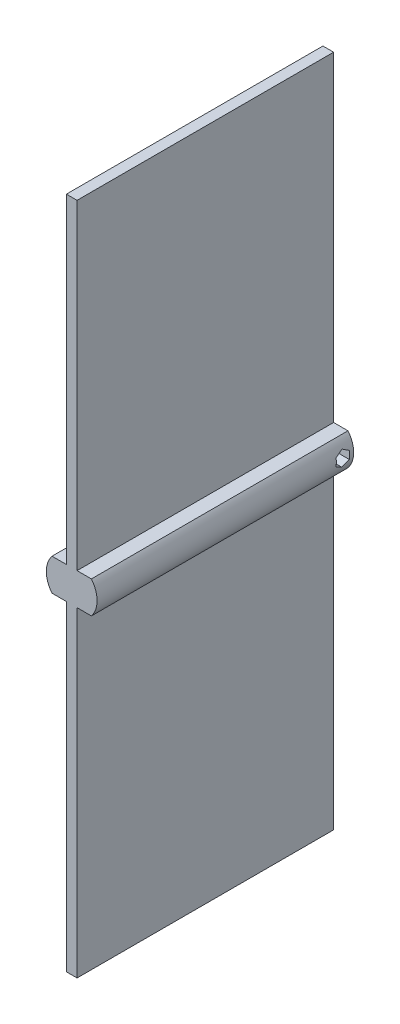
ISO-10303-21;
HEADER;
FILE_DESCRIPTION(('STEP AP214'),'2;1');
FILE_NAME('part.step','',(''),(''),'','','');
FILE_SCHEMA(('AUTOMOTIVE_DESIGN { 1 0 10303 214 1 1 1 1 }'));
ENDSEC;
DATA;
#1=APPLICATION_CONTEXT('core data for automotive mechanical design processes');
#2=APPLICATION_PROTOCOL_DEFINITION('international standard','automotive_design',2000,#1);
#3=PRODUCT_CONTEXT('',#1,'mechanical');
#4=PRODUCT('Part','Part','',(#3));
#5=PRODUCT_RELATED_PRODUCT_CATEGORY('part','',(#4));
#6=PRODUCT_DEFINITION_FORMATION('','',#4);
#7=PRODUCT_DEFINITION_CONTEXT('part definition',#1,'design');
#8=PRODUCT_DEFINITION('design','',#6,#7);
#9=PRODUCT_DEFINITION_SHAPE('','',#8);
#10=(LENGTH_UNIT() NAMED_UNIT(*) SI_UNIT(.MILLI.,.METRE.));
#11=(NAMED_UNIT(*) PLANE_ANGLE_UNIT() SI_UNIT($,.RADIAN.));
#12=(NAMED_UNIT(*) SI_UNIT($,.STERADIAN.) SOLID_ANGLE_UNIT());
#13=UNCERTAINTY_MEASURE_WITH_UNIT(LENGTH_MEASURE(1.E-05),#10,'distance_accuracy_value','');
#14=(GEOMETRIC_REPRESENTATION_CONTEXT(3) GLOBAL_UNCERTAINTY_ASSIGNED_CONTEXT((#13)) GLOBAL_UNIT_ASSIGNED_CONTEXT((#10,
#11,#12)) REPRESENTATION_CONTEXT('',''));
#15=CARTESIAN_POINT('',(0.,0.,0.));
#16=DIRECTION('',(0.,0.,1.));
#17=DIRECTION('',(1.,0.,0.));
#18=AXIS2_PLACEMENT_3D('',#15,#16,#17);
#19=CARTESIAN_POINT('',(3.68272996566406,-3.,48.001));
#20=DIRECTION('',(0.,1.,0.));
#21=DIRECTION('',(0.,0.,1.));
#22=AXIS2_PLACEMENT_3D('',#19,#20,#21);
#23=PLANE('',#22);
#24=DIRECTION('',(1.,0.,0.));
#25=VECTOR('',#24,1.);
#26=CARTESIAN_POINT('',(3.68272996566406,-3.,48.));
#27=LINE('',#26,#25);
#28=CARTESIAN_POINT('',(1.,-3.,48.));
#29=VERTEX_POINT('',#28);
#30=CARTESIAN_POINT('',(3.68272996566406,-3.,48.));
#31=VERTEX_POINT('',#30);
#32=EDGE_CURVE('E235',#29,#31,#27,.T.);
#33=ORIENTED_EDGE('',*,*,#32,.F.);
#34=DIRECTION('',(0.,0.,-1.));
#35=VECTOR('',#34,1.);
#36=CARTESIAN_POINT('',(1.,-3.,48.));
#37=LINE('',#36,#35);
#38=CARTESIAN_POINT('',(1.,-3.,0.));
#39=VERTEX_POINT('',#38);
#40=EDGE_CURVE('E182',#29,#39,#37,.T.);
#41=ORIENTED_EDGE('',*,*,#40,.T.);
#42=DIRECTION('',(1.,0.,0.));
#43=VECTOR('',#42,1.);
#44=CARTESIAN_POINT('',(3.68272996566406,-3.,0.));
#45=LINE('',#44,#43);
#46=CARTESIAN_POINT('',(3.68272996566406,-3.,0.));
#47=VERTEX_POINT('',#46);
#48=EDGE_CURVE('E253',#39,#47,#45,.T.);
#49=ORIENTED_EDGE('',*,*,#48,.T.);
#50=DIRECTION('',(0.,0.,-1.));
#51=VECTOR('',#50,1.);
#52=CARTESIAN_POINT('',(3.68272996566406,-3.,48.001));
#53=LINE('',#52,#51);
#54=EDGE_CURVE('E250',#31,#47,#53,.T.);
#55=ORIENTED_EDGE('',*,*,#54,.F.);
#56=EDGE_LOOP('',(#33,#41,#49,#55));
#57=FACE_BOUND('',#56,.T.);
#58=ADVANCED_FACE('F37',(#57),#23,.F.);
#59=CARTESIAN_POINT('',(3.68272996566406,3.,48.001));
#60=DIRECTION('',(0.,-1.,0.));
#61=DIRECTION('',(0.,0.,-1.));
#62=AXIS2_PLACEMENT_3D('',#59,#60,#61);
#63=PLANE('',#62);
#64=DIRECTION('',(0.,0.,-1.));
#65=VECTOR('',#64,1.);
#66=CARTESIAN_POINT('',(1.,3.,48.));
#67=LINE('',#66,#65);
#68=CARTESIAN_POINT('',(1.,3.,48.));
#69=VERTEX_POINT('',#68);
#70=CARTESIAN_POINT('',(1.,3.,0.));
#71=VERTEX_POINT('',#70);
#72=EDGE_CURVE('E61',#69,#71,#67,.T.);
#73=ORIENTED_EDGE('',*,*,#72,.F.);
#74=DIRECTION('',(-1.,0.,0.));
#75=VECTOR('',#74,1.);
#76=CARTESIAN_POINT('',(3.68272996566406,3.,48.));
#77=LINE('',#76,#75);
#78=CARTESIAN_POINT('',(3.68272996566406,3.,48.));
#79=VERTEX_POINT('',#78);
#80=EDGE_CURVE('E245',#79,#69,#77,.T.);
#81=ORIENTED_EDGE('',*,*,#80,.F.);
#82=DIRECTION('',(0.,0.,-1.));
#83=VECTOR('',#82,1.);
#84=CARTESIAN_POINT('',(3.68272996566406,3.,48.001));
#85=LINE('',#84,#83);
#86=CARTESIAN_POINT('',(3.68272996566406,3.,0.));
#87=VERTEX_POINT('',#86);
#88=EDGE_CURVE('E238',#79,#87,#85,.T.);
#89=ORIENTED_EDGE('',*,*,#88,.T.);
#90=DIRECTION('',(-1.,0.,0.));
#91=VECTOR('',#90,1.);
#92=CARTESIAN_POINT('',(3.68272996566406,3.,0.));
#93=LINE('',#92,#91);
#94=EDGE_CURVE('E236',#87,#71,#93,.T.);
#95=ORIENTED_EDGE('',*,*,#94,.T.);
#96=EDGE_LOOP('',(#73,#81,#89,#95));
#97=FACE_BOUND('',#96,.T.);
#98=ADVANCED_FACE('F336',(#97),#63,.F.);
#99=DIRECTION('',(0.,0.,1.));
#100=VECTOR('',#99,1.);
#101=CARTESIAN_POINT('',(-0.999999999999997,3.,48.));
#102=LINE('',#101,#100);
#103=CARTESIAN_POINT('',(-0.999999999999997,3.,0.));
#104=VERTEX_POINT('',#103);
#105=CARTESIAN_POINT('',(-0.999999999999997,3.,48.));
#106=VERTEX_POINT('',#105);
#107=EDGE_CURVE('E214',#104,#106,#102,.T.);
#108=ORIENTED_EDGE('',*,*,#107,.F.);
#109=CARTESIAN_POINT('',(-3.68272996566406,3.,0.));
#110=VERTEX_POINT('',#109);
#111=EDGE_CURVE('E239',#104,#110,#93,.T.);
#112=ORIENTED_EDGE('',*,*,#111,.T.);
#113=DIRECTION('',(0.,0.,-1.));
#114=VECTOR('',#113,1.);
#115=CARTESIAN_POINT('',(-3.68272996566406,3.,48.001));
#116=LINE('',#115,#114);
#117=CARTESIAN_POINT('',(-3.68272996566406,3.,48.));
#118=VERTEX_POINT('',#117);
#119=EDGE_CURVE('E240',#118,#110,#116,.T.);
#120=ORIENTED_EDGE('',*,*,#119,.F.);
#121=EDGE_CURVE('E243',#106,#118,#77,.T.);
#122=ORIENTED_EDGE('',*,*,#121,.F.);
#123=EDGE_LOOP('',(#108,#112,#120,#122));
#124=FACE_BOUND('',#123,.T.);
#125=ADVANCED_FACE('F352',(#124),#63,.F.);
#126=CARTESIAN_POINT('',(0.,0.,48.));
#127=DIRECTION('',(0.,0.,-1.));
#128=DIRECTION('',(-1.,0.,0.));
#129=AXIS2_PLACEMENT_3D('',#126,#127,#128);
#130=CYLINDRICAL_SURFACE('',#129,4.75);
#131=CARTESIAN_POINT('',(0.,0.,48.));
#132=DIRECTION('',(0.,0.,1.));
#133=DIRECTION('',(1.,0.,0.));
#134=AXIS2_PLACEMENT_3D('',#131,#132,#133);
#135=CIRCLE('',#134,4.75);
#136=CARTESIAN_POINT('',(-3.68272996566406,-3.,48.));
#137=VERTEX_POINT('',#136);
#138=EDGE_CURVE('E11',#118,#137,#135,.T.);
#139=ORIENTED_EDGE('',*,*,#138,.F.);
#140=ORIENTED_EDGE('',*,*,#119,.T.);
#141=CARTESIAN_POINT('',(0.,0.,0.));
#142=DIRECTION('',(0.,0.,1.));
#143=DIRECTION('',(1.,0.,0.));
#144=AXIS2_PLACEMENT_3D('',#141,#142,#143);
#145=CIRCLE('',#144,4.75);
#146=CARTESIAN_POINT('',(-3.68272996566406,-3.,0.));
#147=VERTEX_POINT('',#146);
#148=EDGE_CURVE('E320',#110,#147,#145,.T.);
#149=ORIENTED_EDGE('',*,*,#148,.T.);
#150=DIRECTION('',(0.,0.,-1.));
#151=VECTOR('',#150,1.);
#152=CARTESIAN_POINT('',(-3.68272996566406,-3.,48.001));
#153=LINE('',#152,#151);
#154=EDGE_CURVE('E251',#137,#147,#153,.T.);
#155=ORIENTED_EDGE('',*,*,#154,.F.);
#156=EDGE_LOOP('',(#139,#140,#149,#155));
#157=FACE_BOUND('',#156,.T.);
#158=ADVANCED_FACE('F357',(#157),#130,.T.);
#159=CARTESIAN_POINT('',(0.,0.,-0.392498521632235));
#160=DIRECTION('',(0.,0.852659897031211,-0.522466362548561));
#161=DIRECTION('',(0.,-0.522466362548561,-0.852659897031211));
#162=AXIS2_PLACEMENT_3D('',#159,#160,#161);
#163=ELLIPSE('',#162,9.09149438220246,4.75);
#164=CARTESIAN_POINT('',(4.52554859875823,1.44288249011393,1.96227132316201));
#165=VERTEX_POINT('',#164);
#166=CARTESIAN_POINT('',(4.69979783309166,0.688767252464093,0.731562770466588));
#167=VERTEX_POINT('',#166);
#168=EDGE_CURVE('E291',#165,#167,#163,.T.);
#169=ORIENTED_EDGE('',*,*,#168,.T.);
#170=CARTESIAN_POINT('',(0.,0.,0.749572745126936));
#171=DIRECTION('',(0.,-0.026139194074299,-0.999658312891533));
#172=DIRECTION('',(0.,0.999658312891533,-0.026139194074299));
#173=AXIS2_PLACEMENT_3D('',#170,#171,#172);
#174=ELLIPSE('',#173,4.75162356851765,4.75);
#175=CARTESIAN_POINT('',(4.6897558793976,-0.754115237649842,0.769291447304579));
#176=VERTEX_POINT('',#175);
#177=EDGE_CURVE('E294',#167,#176,#174,.T.);
#178=ORIENTED_EDGE('',*,*,#177,.T.);
#179=CARTESIAN_POINT('',(0.,0.,-0.619490959773289));
#180=DIRECTION('',(0.,-0.87879909110551,-0.477191950342972));
#181=DIRECTION('',(0.,0.477191950342972,-0.87879909110551));
#182=AXIS2_PLACEMENT_3D('',#179,#180,#181);
#183=ELLIPSE('',#182,9.9540656471385,4.75);
#184=CARTESIAN_POINT('',(4.52554859875823,-1.44288249011393,2.03772867683799));
#185=VERTEX_POINT('',#184);
#186=EDGE_CURVE('E296',#176,#185,#183,.T.);
#187=ORIENTED_EDGE('',*,*,#186,.T.);
#188=CARTESIAN_POINT('',(0.,0.,4.39249852163223));
#189=DIRECTION('',(0.,-0.852659897031211,0.522466362548561));
#190=DIRECTION('',(0.,-0.522466362548561,-0.852659897031211));
#191=AXIS2_PLACEMENT_3D('',#188,#189,#190);
#192=ELLIPSE('',#191,9.09149438220246,4.75);
#193=CARTESIAN_POINT('',(4.69979783309166,-0.688767252464093,3.26843722953341));
#194=VERTEX_POINT('',#193);
#195=EDGE_CURVE('E299',#185,#194,#192,.T.);
#196=ORIENTED_EDGE('',*,*,#195,.T.);
#197=CARTESIAN_POINT('',(0.,0.,3.25042725487307));
#198=DIRECTION('',(0.,0.026139194074299,0.999658312891533));
#199=DIRECTION('',(0.,0.999658312891533,-0.026139194074299));
#200=AXIS2_PLACEMENT_3D('',#197,#198,#199);
#201=ELLIPSE('',#200,4.75162356851765,4.75);
#202=CARTESIAN_POINT('',(4.6897558793976,0.754115237649841,3.23070855269542));
#203=VERTEX_POINT('',#202);
#204=EDGE_CURVE('E302',#194,#203,#201,.T.);
#205=ORIENTED_EDGE('',*,*,#204,.T.);
#206=CARTESIAN_POINT('',(0.,0.,4.61949095977329));
#207=DIRECTION('',(0.,0.87879909110551,0.477191950342972));
#208=DIRECTION('',(0.,0.477191950342972,-0.87879909110551));
#209=AXIS2_PLACEMENT_3D('',#206,#207,#208);
#210=ELLIPSE('',#209,9.9540656471385,4.75);
#211=EDGE_CURVE('E278',#203,#165,#210,.T.);
#212=ORIENTED_EDGE('',*,*,#211,.T.);
#213=EDGE_LOOP('',(#169,#178,#187,#196,#205,#212));
#214=FACE_BOUND('',#213,.T.);
#215=EDGE_CURVE('E41',#47,#87,#145,.T.);
#216=ORIENTED_EDGE('',*,*,#215,.T.);
#217=ORIENTED_EDGE('',*,*,#88,.F.);
#218=EDGE_CURVE('E46',#31,#79,#135,.T.);
#219=ORIENTED_EDGE('',*,*,#218,.F.);
#220=ORIENTED_EDGE('',*,*,#54,.T.);
#221=EDGE_LOOP('',(#216,#217,#219,#220));
#222=FACE_BOUND('',#221,.T.);
#223=ADVANCED_FACE('F39',(#214,#222),#130,.T.);
#224=CARTESIAN_POINT('',(0.,0.,48.));
#225=DIRECTION('',(0.,0.,1.));
#226=DIRECTION('',(1.,0.,0.));
#227=AXIS2_PLACEMENT_3D('',#224,#225,#226);
#228=PLANE('',#227);
#229=ORIENTED_EDGE('',*,*,#80,.T.);
#230=DIRECTION('',(0.,-1.,0.));
#231=VECTOR('',#230,1.);
#232=CARTESIAN_POINT('',(1.,63.,48.));
#233=LINE('',#232,#231);
#234=CARTESIAN_POINT('',(1.,63.,48.));
#235=VERTEX_POINT('',#234);
#236=EDGE_CURVE('E220',#235,#69,#233,.T.);
#237=ORIENTED_EDGE('',*,*,#236,.F.);
#238=DIRECTION('',(1.,0.,0.));
#239=VECTOR('',#238,1.);
#240=CARTESIAN_POINT('',(-0.999999999999997,63.,48.));
#241=LINE('',#240,#239);
#242=CARTESIAN_POINT('',(-0.999999999999997,63.,48.));
#243=VERTEX_POINT('',#242);
#244=EDGE_CURVE('E218',#243,#235,#241,.T.);
#245=ORIENTED_EDGE('',*,*,#244,.F.);
#246=DIRECTION('',(0.,-1.,0.));
#247=VECTOR('',#246,1.);
#248=CARTESIAN_POINT('',(-0.999999999999997,63.,48.));
#249=LINE('',#248,#247);
#250=EDGE_CURVE('E226',#243,#106,#249,.T.);
#251=ORIENTED_EDGE('',*,*,#250,.T.);
#252=ORIENTED_EDGE('',*,*,#121,.T.);
#253=ORIENTED_EDGE('',*,*,#138,.T.);
#254=CARTESIAN_POINT('',(-0.999999999999998,-3.,48.));
#255=VERTEX_POINT('',#254);
#256=EDGE_CURVE('E248',#137,#255,#27,.T.);
#257=ORIENTED_EDGE('',*,*,#256,.T.);
#258=DIRECTION('',(0.,1.,0.));
#259=VECTOR('',#258,1.);
#260=CARTESIAN_POINT('',(-0.999999999999997,-63.,48.));
#261=LINE('',#260,#259);
#262=CARTESIAN_POINT('',(-0.999999999999997,-63.,48.));
#263=VERTEX_POINT('',#262);
#264=EDGE_CURVE('E53',#263,#255,#261,.T.);
#265=ORIENTED_EDGE('',*,*,#264,.F.);
#266=DIRECTION('',(1.,0.,0.));
#267=VECTOR('',#266,1.);
#268=CARTESIAN_POINT('',(-0.999999999999997,-63.,48.));
#269=LINE('',#268,#267);
#270=CARTESIAN_POINT('',(1.,-63.,48.));
#271=VERTEX_POINT('',#270);
#272=EDGE_CURVE('E191',#263,#271,#269,.T.);
#273=ORIENTED_EDGE('',*,*,#272,.T.);
#274=DIRECTION('',(0.,1.,0.));
#275=VECTOR('',#274,1.);
#276=CARTESIAN_POINT('',(1.,-63.,48.));
#277=LINE('',#276,#275);
#278=EDGE_CURVE('E176',#271,#29,#277,.T.);
#279=ORIENTED_EDGE('',*,*,#278,.T.);
#280=ORIENTED_EDGE('',*,*,#32,.T.);
#281=ORIENTED_EDGE('',*,*,#218,.T.);
#282=EDGE_LOOP('',(#229,#237,#245,#251,#252,#253,#257,#265,#273,#279,#280,#281));
#283=FACE_BOUND('',#282,.T.);
#284=ADVANCED_FACE('F196',(#283),#228,.T.);
#285=CARTESIAN_POINT('',(0.,0.,0.));
#286=DIRECTION('',(0.,0.,1.));
#287=DIRECTION('',(1.,0.,0.));
#288=AXIS2_PLACEMENT_3D('',#285,#286,#287);
#289=PLANE('',#288);
#290=DIRECTION('',(0.,-1.,0.));
#291=VECTOR('',#290,1.);
#292=CARTESIAN_POINT('',(0.94,1.53505700219894,0.));
#293=LINE('',#292,#291);
#294=CARTESIAN_POINT('',(0.94,1.53505700219894,0.));
#295=VERTEX_POINT('',#294);
#296=CARTESIAN_POINT('',(0.94,-1.53505700219894,0.));
#297=VERTEX_POINT('',#296);
#298=EDGE_CURVE('E309',#295,#297,#293,.T.);
#299=ORIENTED_EDGE('',*,*,#298,.F.);
#300=CARTESIAN_POINT('',(0.,0.,0.));
#301=DIRECTION('',(0.,0.,-1.));
#302=DIRECTION('',(-1.,0.,0.));
#303=AXIS2_PLACEMENT_3D('',#300,#301,#302);
#304=CIRCLE('',#303,1.8);
#305=EDGE_CURVE('E304',#297,#295,#304,.T.);
#306=ORIENTED_EDGE('',*,*,#305,.F.);
#307=EDGE_LOOP('',(#299,#306));
#308=FACE_BOUND('',#307,.T.);
#309=ORIENTED_EDGE('',*,*,#148,.F.);
#310=ORIENTED_EDGE('',*,*,#111,.F.);
#311=DIRECTION('',(0.,-1.,0.));
#312=VECTOR('',#311,1.);
#313=CARTESIAN_POINT('',(-0.999999999999998,63.,0.));
#314=LINE('',#313,#312);
#315=CARTESIAN_POINT('',(-0.999999999999998,63.,0.));
#316=VERTEX_POINT('',#315);
#317=EDGE_CURVE('E229',#316,#104,#314,.T.);
#318=ORIENTED_EDGE('',*,*,#317,.F.);
#319=DIRECTION('',(-1.,0.,0.));
#320=VECTOR('',#319,1.);
#321=CARTESIAN_POINT('',(-0.999999999999998,63.,0.));
#322=LINE('',#321,#320);
#323=CARTESIAN_POINT('',(1.,63.,0.));
#324=VERTEX_POINT('',#323);
#325=EDGE_CURVE('E213',#324,#316,#322,.T.);
#326=ORIENTED_EDGE('',*,*,#325,.F.);
#327=DIRECTION('',(0.,-1.,0.));
#328=VECTOR('',#327,1.);
#329=CARTESIAN_POINT('',(1.,63.,0.));
#330=LINE('',#329,#328);
#331=EDGE_CURVE('E232',#324,#71,#330,.T.);
#332=ORIENTED_EDGE('',*,*,#331,.T.);
#333=ORIENTED_EDGE('',*,*,#94,.F.);
#334=ORIENTED_EDGE('',*,*,#215,.F.);
#335=ORIENTED_EDGE('',*,*,#48,.F.);
#336=DIRECTION('',(0.,1.,0.));
#337=VECTOR('',#336,1.);
#338=CARTESIAN_POINT('',(1.,-63.,0.));
#339=LINE('',#338,#337);
#340=CARTESIAN_POINT('',(1.,-63.,0.));
#341=VERTEX_POINT('',#340);
#342=EDGE_CURVE('E203',#341,#39,#339,.T.);
#343=ORIENTED_EDGE('',*,*,#342,.F.);
#344=DIRECTION('',(-1.,0.,0.));
#345=VECTOR('',#344,1.);
#346=CARTESIAN_POINT('',(-0.999999999999998,-63.,0.));
#347=LINE('',#346,#345);
#348=CARTESIAN_POINT('',(-0.999999999999998,-63.,0.));
#349=VERTEX_POINT('',#348);
#350=EDGE_CURVE('E193',#341,#349,#347,.T.);
#351=ORIENTED_EDGE('',*,*,#350,.T.);
#352=DIRECTION('',(0.,1.,0.));
#353=VECTOR('',#352,1.);
#354=CARTESIAN_POINT('',(-0.999999999999998,-63.,0.));
#355=LINE('',#354,#353);
#356=CARTESIAN_POINT('',(-0.999999999999998,-3.,0.));
#357=VERTEX_POINT('',#356);
#358=EDGE_CURVE('E207',#349,#357,#355,.T.);
#359=ORIENTED_EDGE('',*,*,#358,.T.);
#360=EDGE_CURVE('E256',#147,#357,#45,.T.);
#361=ORIENTED_EDGE('',*,*,#360,.F.);
#362=EDGE_LOOP('',(#309,#310,#318,#326,#332,#333,#334,#335,#343,#351,#359,#361));
#363=FACE_BOUND('',#362,.T.);
#364=ADVANCED_FACE('F334',(#308,#363),#289,.F.);
#365=CARTESIAN_POINT('',(0.,0.,10.));
#366=DIRECTION('',(0.,0.,-1.));
#367=DIRECTION('',(-1.,0.,0.));
#368=AXIS2_PLACEMENT_3D('',#365,#366,#367);
#369=CYLINDRICAL_SURFACE('',#368,1.8);
#370=ORIENTED_EDGE('',*,*,#305,.T.);
#371=DIRECTION('',(0.,0.,-1.));
#372=VECTOR('',#371,1.);
#373=CARTESIAN_POINT('',(0.94,1.53505700219894,10.));
#374=LINE('',#373,#372);
#375=CARTESIAN_POINT('',(0.94,1.53505700219894,10.));
#376=VERTEX_POINT('',#375);
#377=EDGE_CURVE('E312',#376,#295,#374,.T.);
#378=ORIENTED_EDGE('',*,*,#377,.F.);
#379=CARTESIAN_POINT('',(0.,0.,10.));
#380=DIRECTION('',(0.,0.,-1.));
#381=DIRECTION('',(-1.,0.,0.));
#382=AXIS2_PLACEMENT_3D('',#379,#380,#381);
#383=CIRCLE('',#382,1.8);
#384=CARTESIAN_POINT('',(0.94,-1.53505700219894,10.));
#385=VERTEX_POINT('',#384);
#386=EDGE_CURVE('E305',#385,#376,#383,.T.);
#387=ORIENTED_EDGE('',*,*,#386,.F.);
#388=DIRECTION('',(0.,0.,-1.));
#389=VECTOR('',#388,1.);
#390=CARTESIAN_POINT('',(0.94,-1.53505700219894,10.));
#391=LINE('',#390,#389);
#392=EDGE_CURVE('E316',#385,#297,#391,.T.);
#393=ORIENTED_EDGE('',*,*,#392,.T.);
#394=EDGE_LOOP('',(#370,#378,#387,#393));
#395=FACE_BOUND('',#394,.T.);
#396=ADVANCED_FACE('F402',(#395),#369,.F.);
#397=CARTESIAN_POINT('',(0.94,1.53505700219894,10.));
#398=DIRECTION('',(1.,0.,0.));
#399=DIRECTION('',(0.,0.,-1.));
#400=AXIS2_PLACEMENT_3D('',#397,#398,#399);
#401=PLANE('',#400);
#402=DIRECTION('',(0.,0.477191950342972,-0.87879909110551));
#403=VECTOR('',#402,1.);
#404=CARTESIAN_POINT('',(0.94,0.754115237649841,3.23070855269542));
#405=LINE('',#404,#403);
#406=CARTESIAN_POINT('',(0.94,0.754115237649841,3.23070855269542));
#407=VERTEX_POINT('',#406);
#408=CARTESIAN_POINT('',(0.94,1.44288249011393,1.96227132316201));
#409=VERTEX_POINT('',#408);
#410=EDGE_CURVE('E260',#407,#409,#405,.T.);
#411=ORIENTED_EDGE('',*,*,#410,.F.);
#412=DIRECTION('',(0.,0.999658312891533,-0.026139194074299));
#413=VECTOR('',#412,1.);
#414=CARTESIAN_POINT('',(0.94,-0.688767252464093,3.26843722953341));
#415=LINE('',#414,#413);
#416=CARTESIAN_POINT('',(0.94,-0.688767252464093,3.26843722953341));
#417=VERTEX_POINT('',#416);
#418=EDGE_CURVE('E247',#417,#407,#415,.T.);
#419=ORIENTED_EDGE('',*,*,#418,.F.);
#420=DIRECTION('',(0.,0.522466362548561,0.852659897031211));
#421=VECTOR('',#420,1.);
#422=CARTESIAN_POINT('',(0.94,-1.44288249011393,2.03772867683799));
#423=LINE('',#422,#421);
#424=CARTESIAN_POINT('',(0.94,-1.44288249011393,2.03772867683799));
#425=VERTEX_POINT('',#424);
#426=EDGE_CURVE('E272',#425,#417,#423,.T.);
#427=ORIENTED_EDGE('',*,*,#426,.F.);
#428=DIRECTION('',(0.,-0.477191950342972,0.87879909110551));
#429=VECTOR('',#428,1.);
#430=CARTESIAN_POINT('',(0.94,-0.754115237649842,0.769291447304579));
#431=LINE('',#430,#429);
#432=CARTESIAN_POINT('',(0.94,-0.754115237649842,0.769291447304579));
#433=VERTEX_POINT('',#432);
#434=EDGE_CURVE('E269',#433,#425,#431,.T.);
#435=ORIENTED_EDGE('',*,*,#434,.F.);
#436=DIRECTION('',(0.,-0.999658312891533,0.026139194074299));
#437=VECTOR('',#436,1.);
#438=CARTESIAN_POINT('',(0.94,0.688767252464093,0.731562770466588));
#439=LINE('',#438,#437);
#440=CARTESIAN_POINT('',(0.94,0.688767252464093,0.731562770466588));
#441=VERTEX_POINT('',#440);
#442=EDGE_CURVE('E266',#441,#433,#439,.T.);
#443=ORIENTED_EDGE('',*,*,#442,.F.);
#444=DIRECTION('',(0.,-0.522466362548561,-0.852659897031211));
#445=VECTOR('',#444,1.);
#446=CARTESIAN_POINT('',(0.94,1.44288249011393,1.96227132316201));
#447=LINE('',#446,#445);
#448=EDGE_CURVE('E263',#409,#441,#447,.T.);
#449=ORIENTED_EDGE('',*,*,#448,.F.);
#450=EDGE_LOOP('',(#411,#419,#427,#435,#443,#449));
#451=FACE_BOUND('',#450,.T.);
#452=ORIENTED_EDGE('',*,*,#298,.T.);
#453=ORIENTED_EDGE('',*,*,#392,.F.);
#454=DIRECTION('',(0.,-1.,0.));
#455=VECTOR('',#454,1.);
#456=CARTESIAN_POINT('',(0.94,1.53505700219894,10.));
#457=LINE('',#456,#455);
#458=EDGE_CURVE('E308',#376,#385,#457,.T.);
#459=ORIENTED_EDGE('',*,*,#458,.F.);
#460=ORIENTED_EDGE('',*,*,#377,.T.);
#461=EDGE_LOOP('',(#452,#453,#459,#460));
#462=FACE_BOUND('',#461,.T.);
#463=ADVANCED_FACE('F398',(#451,#462),#401,.F.);
#464=CARTESIAN_POINT('',(0.,0.,10.));
#465=DIRECTION('',(0.,0.,-1.));
#466=DIRECTION('',(-1.,0.,0.));
#467=AXIS2_PLACEMENT_3D('',#464,#465,#466);
#468=PLANE('',#467);
#469=ORIENTED_EDGE('',*,*,#386,.T.);
#470=ORIENTED_EDGE('',*,*,#458,.T.);
#471=EDGE_LOOP('',(#469,#470));
#472=FACE_BOUND('',#471,.T.);
#473=ADVANCED_FACE('F394',(#472),#468,.T.);
#474=CARTESIAN_POINT('',(4.75,-0.688767252464093,3.26843722953341));
#475=DIRECTION('',(0.,0.026139194074299,0.999658312891533));
#476=DIRECTION('',(0.,-0.999658312891533,0.026139194074299));
#477=AXIS2_PLACEMENT_3D('',#474,#475,#476);
#478=PLANE('',#477);
#479=DIRECTION('',(-1.,0.,0.));
#480=VECTOR('',#479,1.);
#481=CARTESIAN_POINT('',(4.75,-0.688767252464093,3.26843722953341));
#482=LINE('',#481,#480);
#483=EDGE_CURVE('E276',#194,#417,#482,.T.);
#484=ORIENTED_EDGE('',*,*,#483,.T.);
#485=ORIENTED_EDGE('',*,*,#418,.T.);
#486=DIRECTION('',(-1.,0.,0.));
#487=VECTOR('',#486,1.);
#488=CARTESIAN_POINT('',(4.75,0.754115237649841,3.23070855269542));
#489=LINE('',#488,#487);
#490=EDGE_CURVE('E275',#203,#407,#489,.T.);
#491=ORIENTED_EDGE('',*,*,#490,.F.);
#492=ORIENTED_EDGE('',*,*,#204,.F.);
#493=EDGE_LOOP('',(#484,#485,#491,#492));
#494=FACE_BOUND('',#493,.T.);
#495=ADVANCED_FACE('F390',(#494),#478,.F.);
#496=CARTESIAN_POINT('',(4.75,-1.44288249011393,2.03772867683799));
#497=DIRECTION('',(0.,-0.852659897031211,0.522466362548561));
#498=DIRECTION('',(0.,-0.522466362548561,-0.852659897031211));
#499=AXIS2_PLACEMENT_3D('',#496,#497,#498);
#500=PLANE('',#499);
#501=DIRECTION('',(-1.,0.,0.));
#502=VECTOR('',#501,1.);
#503=CARTESIAN_POINT('',(4.75,-1.44288249011393,2.03772867683799));
#504=LINE('',#503,#502);
#505=EDGE_CURVE('E279',#185,#425,#504,.T.);
#506=ORIENTED_EDGE('',*,*,#505,.T.);
#507=ORIENTED_EDGE('',*,*,#426,.T.);
#508=ORIENTED_EDGE('',*,*,#483,.F.);
#509=ORIENTED_EDGE('',*,*,#195,.F.);
#510=EDGE_LOOP('',(#506,#507,#508,#509));
#511=FACE_BOUND('',#510,.T.);
#512=ADVANCED_FACE('F393',(#511),#500,.F.);
#513=CARTESIAN_POINT('',(4.75,-0.754115237649842,0.769291447304579));
#514=DIRECTION('',(0.,-0.87879909110551,-0.477191950342972));
#515=DIRECTION('',(0.,0.477191950342972,-0.87879909110551));
#516=AXIS2_PLACEMENT_3D('',#513,#514,#515);
#517=PLANE('',#516);
#518=DIRECTION('',(-1.,0.,0.));
#519=VECTOR('',#518,1.);
#520=CARTESIAN_POINT('',(4.75,-0.754115237649842,0.769291447304579));
#521=LINE('',#520,#519);
#522=EDGE_CURVE('E281',#176,#433,#521,.T.);
#523=ORIENTED_EDGE('',*,*,#522,.T.);
#524=ORIENTED_EDGE('',*,*,#434,.T.);
#525=ORIENTED_EDGE('',*,*,#505,.F.);
#526=ORIENTED_EDGE('',*,*,#186,.F.);
#527=EDGE_LOOP('',(#523,#524,#525,#526));
#528=FACE_BOUND('',#527,.T.);
#529=ADVANCED_FACE('F441',(#528),#517,.F.);
#530=CARTESIAN_POINT('',(4.75,0.688767252464093,0.731562770466588));
#531=DIRECTION('',(0.,-0.026139194074299,-0.999658312891533));
#532=DIRECTION('',(0.,0.999658312891533,-0.026139194074299));
#533=AXIS2_PLACEMENT_3D('',#530,#531,#532);
#534=PLANE('',#533);
#535=DIRECTION('',(-1.,0.,0.));
#536=VECTOR('',#535,1.);
#537=CARTESIAN_POINT('',(4.75,0.688767252464093,0.731562770466588));
#538=LINE('',#537,#536);
#539=EDGE_CURVE('E283',#167,#441,#538,.T.);
#540=ORIENTED_EDGE('',*,*,#539,.T.);
#541=ORIENTED_EDGE('',*,*,#442,.T.);
#542=ORIENTED_EDGE('',*,*,#522,.F.);
#543=ORIENTED_EDGE('',*,*,#177,.F.);
#544=EDGE_LOOP('',(#540,#541,#542,#543));
#545=FACE_BOUND('',#544,.T.);
#546=ADVANCED_FACE('F385',(#545),#534,.F.);
#547=CARTESIAN_POINT('',(4.75,1.44288249011393,1.96227132316201));
#548=DIRECTION('',(0.,0.852659897031211,-0.522466362548561));
#549=DIRECTION('',(0.,0.522466362548561,0.852659897031211));
#550=AXIS2_PLACEMENT_3D('',#547,#548,#549);
#551=PLANE('',#550);
#552=DIRECTION('',(-1.,0.,0.));
#553=VECTOR('',#552,1.);
#554=CARTESIAN_POINT('',(4.75,1.44288249011393,1.96227132316201));
#555=LINE('',#554,#553);
#556=EDGE_CURVE('E285',#165,#409,#555,.T.);
#557=ORIENTED_EDGE('',*,*,#556,.T.);
#558=ORIENTED_EDGE('',*,*,#448,.T.);
#559=ORIENTED_EDGE('',*,*,#539,.F.);
#560=ORIENTED_EDGE('',*,*,#168,.F.);
#561=EDGE_LOOP('',(#557,#558,#559,#560));
#562=FACE_BOUND('',#561,.T.);
#563=ADVANCED_FACE('F379',(#562),#551,.F.);
#564=CARTESIAN_POINT('',(4.75,0.754115237649841,3.23070855269542));
#565=DIRECTION('',(0.,0.87879909110551,0.477191950342972));
#566=DIRECTION('',(0.,-0.477191950342972,0.87879909110551));
#567=AXIS2_PLACEMENT_3D('',#564,#565,#566);
#568=PLANE('',#567);
#569=ORIENTED_EDGE('',*,*,#490,.T.);
#570=ORIENTED_EDGE('',*,*,#410,.T.);
#571=ORIENTED_EDGE('',*,*,#556,.F.);
#572=ORIENTED_EDGE('',*,*,#211,.F.);
#573=EDGE_LOOP('',(#569,#570,#571,#572));
#574=FACE_BOUND('',#573,.T.);
#575=ADVANCED_FACE('F373',(#574),#568,.F.);
#576=ORIENTED_EDGE('',*,*,#360,.T.);
#577=DIRECTION('',(0.,0.,1.));
#578=VECTOR('',#577,1.);
#579=CARTESIAN_POINT('',(-0.999999999999997,-3.,48.));
#580=LINE('',#579,#578);
#581=EDGE_CURVE('E194',#357,#255,#580,.T.);
#582=ORIENTED_EDGE('',*,*,#581,.T.);
#583=ORIENTED_EDGE('',*,*,#256,.F.);
#584=ORIENTED_EDGE('',*,*,#154,.T.);
#585=EDGE_LOOP('',(#576,#582,#583,#584));
#586=FACE_BOUND('',#585,.T.);
#587=ADVANCED_FACE('F355',(#586),#23,.F.);
#588=CARTESIAN_POINT('',(1.,63.,48.));
#589=DIRECTION('',(-1.,0.,0.));
#590=DIRECTION('',(0.,0.,1.));
#591=AXIS2_PLACEMENT_3D('',#588,#589,#590);
#592=PLANE('',#591);
#593=ORIENTED_EDGE('',*,*,#72,.T.);
#594=ORIENTED_EDGE('',*,*,#331,.F.);
#595=DIRECTION('',(0.,0.,-1.));
#596=VECTOR('',#595,1.);
#597=CARTESIAN_POINT('',(1.,63.,48.));
#598=LINE('',#597,#596);
#599=EDGE_CURVE('E210',#235,#324,#598,.T.);
#600=ORIENTED_EDGE('',*,*,#599,.F.);
#601=ORIENTED_EDGE('',*,*,#236,.T.);
#602=EDGE_LOOP('',(#593,#594,#600,#601));
#603=FACE_BOUND('',#602,.T.);
#604=ADVANCED_FACE('F341',(#603),#592,.F.);
#605=CARTESIAN_POINT('',(-0.999999999999997,63.,48.));
#606=DIRECTION('',(1.,0.,0.));
#607=DIRECTION('',(0.,0.,-1.));
#608=AXIS2_PLACEMENT_3D('',#605,#606,#607);
#609=PLANE('',#608);
#610=ORIENTED_EDGE('',*,*,#107,.T.);
#611=ORIENTED_EDGE('',*,*,#250,.F.);
#612=DIRECTION('',(0.,0.,1.));
#613=VECTOR('',#612,1.);
#614=CARTESIAN_POINT('',(-0.999999999999997,63.,48.));
#615=LINE('',#614,#613);
#616=EDGE_CURVE('E216',#316,#243,#615,.T.);
#617=ORIENTED_EDGE('',*,*,#616,.F.);
#618=ORIENTED_EDGE('',*,*,#317,.T.);
#619=EDGE_LOOP('',(#610,#611,#617,#618));
#620=FACE_BOUND('',#619,.T.);
#621=ADVANCED_FACE('F349',(#620),#609,.F.);
#622=CARTESIAN_POINT('',(0.,63.,0.));
#623=DIRECTION('',(0.,-1.,0.));
#624=DIRECTION('',(0.,0.,-1.));
#625=AXIS2_PLACEMENT_3D('',#622,#623,#624);
#626=PLANE('',#625);
#627=ORIENTED_EDGE('',*,*,#599,.T.);
#628=ORIENTED_EDGE('',*,*,#325,.T.);
#629=ORIENTED_EDGE('',*,*,#616,.T.);
#630=ORIENTED_EDGE('',*,*,#244,.T.);
#631=EDGE_LOOP('',(#627,#628,#629,#630));
#632=FACE_BOUND('',#631,.T.);
#633=ADVANCED_FACE('F343',(#632),#626,.F.);
#634=CARTESIAN_POINT('',(1.,-63.,48.));
#635=DIRECTION('',(1.,0.,0.));
#636=DIRECTION('',(0.,0.,-1.));
#637=AXIS2_PLACEMENT_3D('',#634,#635,#636);
#638=PLANE('',#637);
#639=ORIENTED_EDGE('',*,*,#40,.F.);
#640=ORIENTED_EDGE('',*,*,#278,.F.);
#641=DIRECTION('',(0.,0.,-1.));
#642=VECTOR('',#641,1.);
#643=CARTESIAN_POINT('',(1.,-63.,48.));
#644=LINE('',#643,#642);
#645=EDGE_CURVE('E179',#271,#341,#644,.T.);
#646=ORIENTED_EDGE('',*,*,#645,.T.);
#647=ORIENTED_EDGE('',*,*,#342,.T.);
#648=EDGE_LOOP('',(#639,#640,#646,#647));
#649=FACE_BOUND('',#648,.T.);
#650=ADVANCED_FACE('F178',(#649),#638,.T.);
#651=CARTESIAN_POINT('',(-0.999999999999997,-63.,48.));
#652=DIRECTION('',(-1.,0.,0.));
#653=DIRECTION('',(0.,0.,1.));
#654=AXIS2_PLACEMENT_3D('',#651,#652,#653);
#655=PLANE('',#654);
#656=ORIENTED_EDGE('',*,*,#581,.F.);
#657=ORIENTED_EDGE('',*,*,#358,.F.);
#658=DIRECTION('',(0.,0.,1.));
#659=VECTOR('',#658,1.);
#660=CARTESIAN_POINT('',(-0.999999999999997,-63.,48.));
#661=LINE('',#660,#659);
#662=EDGE_CURVE('E198',#349,#263,#661,.T.);
#663=ORIENTED_EDGE('',*,*,#662,.T.);
#664=ORIENTED_EDGE('',*,*,#264,.T.);
#665=EDGE_LOOP('',(#656,#657,#663,#664));
#666=FACE_BOUND('',#665,.T.);
#667=ADVANCED_FACE('F545',(#666),#655,.T.);
#668=CARTESIAN_POINT('',(0.,-63.,0.));
#669=DIRECTION('',(0.,1.,0.));
#670=DIRECTION('',(0.,0.,-1.));
#671=AXIS2_PLACEMENT_3D('',#668,#669,#670);
#672=PLANE('',#671);
#673=ORIENTED_EDGE('',*,*,#645,.F.);
#674=ORIENTED_EDGE('',*,*,#272,.F.);
#675=ORIENTED_EDGE('',*,*,#662,.F.);
#676=ORIENTED_EDGE('',*,*,#350,.F.);
#677=EDGE_LOOP('',(#673,#674,#675,#676));
#678=FACE_BOUND('',#677,.T.);
#679=ADVANCED_FACE('F189',(#678),#672,.F.);
#680=CLOSED_SHELL('',(#58,#98,#125,#158,#223,#284,#364,#396,#463,#473,#495,#512,#529,#546,#563,
#575,#587,#604,#621,#633,#650,#667,#679));
#681=MANIFOLD_SOLID_BREP('B2',#680);
#682=ADVANCED_BREP_SHAPE_REPRESENTATION('',(#18,#681),#14);
#683=SHAPE_DEFINITION_REPRESENTATION(#9,#682);
ENDSEC;
END-ISO-10303-21;
